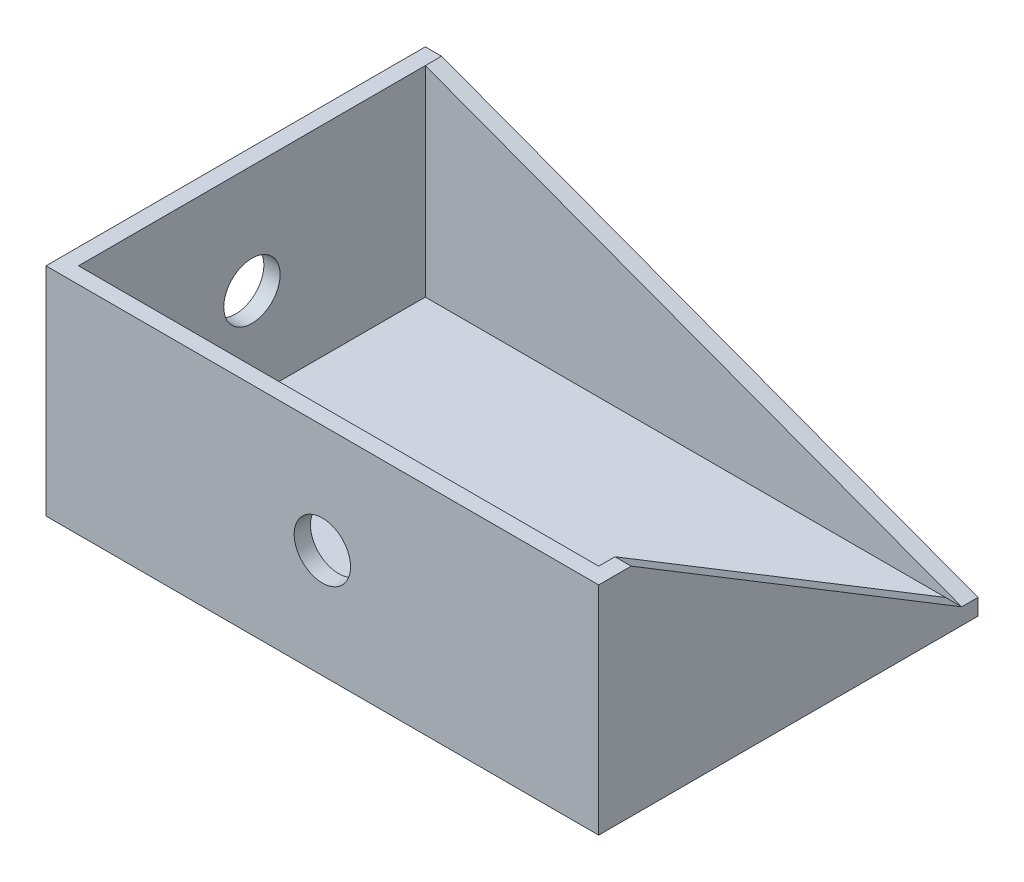
ISO-10303-21;
HEADER;
FILE_DESCRIPTION(('STEP AP214'),'2;1');
FILE_NAME('part.step','',(''),(''),'','','');
FILE_SCHEMA(('AUTOMOTIVE_DESIGN { 1 0 10303 214 1 1 1 1 }'));
ENDSEC;
DATA;
#1=APPLICATION_CONTEXT('core data for automotive mechanical design processes');
#2=APPLICATION_PROTOCOL_DEFINITION('international standard','automotive_design',2000,#1);
#3=PRODUCT_CONTEXT('',#1,'mechanical');
#4=PRODUCT('Part','Part','',(#3));
#5=PRODUCT_RELATED_PRODUCT_CATEGORY('part','',(#4));
#6=PRODUCT_DEFINITION_FORMATION('','',#4);
#7=PRODUCT_DEFINITION_CONTEXT('part definition',#1,'design');
#8=PRODUCT_DEFINITION('design','',#6,#7);
#9=PRODUCT_DEFINITION_SHAPE('','',#8);
#10=(LENGTH_UNIT() NAMED_UNIT(*) SI_UNIT(.MILLI.,.METRE.));
#11=(NAMED_UNIT(*) PLANE_ANGLE_UNIT() SI_UNIT($,.RADIAN.));
#12=(NAMED_UNIT(*) SI_UNIT($,.STERADIAN.) SOLID_ANGLE_UNIT());
#13=UNCERTAINTY_MEASURE_WITH_UNIT(LENGTH_MEASURE(1.E-05),#10,'distance_accuracy_value','');
#14=(GEOMETRIC_REPRESENTATION_CONTEXT(3) GLOBAL_UNCERTAINTY_ASSIGNED_CONTEXT((#13)) GLOBAL_UNIT_ASSIGNED_CONTEXT((#10,
#11,#12)) REPRESENTATION_CONTEXT('',''));
#15=CARTESIAN_POINT('',(0.,0.,0.));
#16=DIRECTION('',(0.,0.,1.));
#17=DIRECTION('',(1.,0.,0.));
#18=AXIS2_PLACEMENT_3D('',#15,#16,#17);
#19=CARTESIAN_POINT('',(0.,20.,0.));
#20=DIRECTION('',(1.,0.,0.));
#21=DIRECTION('',(0.,0.,-1.));
#22=AXIS2_PLACEMENT_3D('',#19,#20,#21);
#23=PLANE('',#22);
#24=CARTESIAN_POINT('',(0.,10.,-17.5));
#25=DIRECTION('',(-1.,0.,0.));
#26=DIRECTION('',(0.,0.,1.));
#27=AXIS2_PLACEMENT_3D('',#24,#25,#26);
#28=CIRCLE('',#27,2.6);
#29=CARTESIAN_POINT('',(0.,10.,-14.9));
#30=VERTEX_POINT('',#29);
#31=EDGE_CURVE('E169',#30,#30,#28,.T.);
#32=ORIENTED_EDGE('',*,*,#31,.F.);
#33=EDGE_LOOP('',(#32));
#34=FACE_BOUND('',#33,.T.);
#35=DIRECTION('',(0.,0.,1.));
#36=VECTOR('',#35,1.);
#37=CARTESIAN_POINT('',(0.,0.,0.));
#38=LINE('',#37,#36);
#39=CARTESIAN_POINT('',(0.,0.,-35.));
#40=VERTEX_POINT('',#39);
#41=CARTESIAN_POINT('',(0.,0.,0.));
#42=VERTEX_POINT('',#41);
#43=EDGE_CURVE('E149',#40,#42,#38,.T.);
#44=ORIENTED_EDGE('',*,*,#43,.T.);
#45=DIRECTION('',(0.,-1.,0.));
#46=VECTOR('',#45,1.);
#47=CARTESIAN_POINT('',(0.,20.,0.));
#48=LINE('',#47,#46);
#49=CARTESIAN_POINT('',(0.,20.,0.));
#50=VERTEX_POINT('',#49);
#51=EDGE_CURVE('E47',#50,#42,#48,.T.);
#52=ORIENTED_EDGE('',*,*,#51,.F.);
#53=DIRECTION('',(0.,0.,1.));
#54=VECTOR('',#53,1.);
#55=CARTESIAN_POINT('',(0.,20.,0.));
#56=LINE('',#55,#54);
#57=CARTESIAN_POINT('',(0.,20.,-35.));
#58=VERTEX_POINT('',#57);
#59=EDGE_CURVE('E145',#58,#50,#56,.T.);
#60=ORIENTED_EDGE('',*,*,#59,.F.);
#61=DIRECTION('',(0.,-1.,0.));
#62=VECTOR('',#61,1.);
#63=CARTESIAN_POINT('',(0.,20.,-35.));
#64=LINE('',#63,#62);
#65=EDGE_CURVE('E143',#58,#40,#64,.T.);
#66=ORIENTED_EDGE('',*,*,#65,.T.);
#67=EDGE_LOOP('',(#44,#52,#60,#66));
#68=FACE_BOUND('',#67,.T.);
#69=ADVANCED_FACE('F39',(#34,#68),#23,.F.);
#70=CARTESIAN_POINT('',(0.,20.,0.));
#71=DIRECTION('',(0.,0.,-1.));
#72=DIRECTION('',(-1.,0.,0.));
#73=AXIS2_PLACEMENT_3D('',#70,#71,#72);
#74=PLANE('',#73);
#75=CARTESIAN_POINT('',(25.5,10.,0.));
#76=DIRECTION('',(0.,0.,1.));
#77=DIRECTION('',(1.,0.,0.));
#78=AXIS2_PLACEMENT_3D('',#75,#76,#77);
#79=CIRCLE('',#78,2.6);
#80=CARTESIAN_POINT('',(28.1,10.,0.));
#81=VERTEX_POINT('',#80);
#82=EDGE_CURVE('E166',#81,#81,#79,.T.);
#83=ORIENTED_EDGE('',*,*,#82,.F.);
#84=EDGE_LOOP('',(#83));
#85=FACE_BOUND('',#84,.T.);
#86=DIRECTION('',(1.,0.,0.));
#87=VECTOR('',#86,1.);
#88=CARTESIAN_POINT('',(0.,0.,0.));
#89=LINE('',#88,#87);
#90=CARTESIAN_POINT('',(51.,0.,0.));
#91=VERTEX_POINT('',#90);
#92=EDGE_CURVE('E152',#42,#91,#89,.T.);
#93=ORIENTED_EDGE('',*,*,#92,.T.);
#94=DIRECTION('',(0.,-1.,0.));
#95=VECTOR('',#94,1.);
#96=CARTESIAN_POINT('',(51.,20.,0.));
#97=LINE('',#96,#95);
#98=CARTESIAN_POINT('',(51.,20.,0.));
#99=VERTEX_POINT('',#98);
#100=EDGE_CURVE('E160',#99,#91,#97,.T.);
#101=ORIENTED_EDGE('',*,*,#100,.F.);
#102=DIRECTION('',(1.,0.,0.));
#103=VECTOR('',#102,1.);
#104=CARTESIAN_POINT('',(0.,20.,0.));
#105=LINE('',#104,#103);
#106=EDGE_CURVE('E83',#50,#99,#105,.T.);
#107=ORIENTED_EDGE('',*,*,#106,.F.);
#108=ORIENTED_EDGE('',*,*,#51,.T.);
#109=EDGE_LOOP('',(#93,#101,#107,#108));
#110=FACE_BOUND('',#109,.T.);
#111=ADVANCED_FACE('F209',(#85,#110),#74,.F.);
#112=CARTESIAN_POINT('',(51.,20.,0.));
#113=DIRECTION('',(-1.,0.,0.));
#114=DIRECTION('',(0.,0.,1.));
#115=AXIS2_PLACEMENT_3D('',#112,#113,#114);
#116=PLANE('',#115);
#117=DIRECTION('',(0.,0.,-1.));
#118=VECTOR('',#117,1.);
#119=CARTESIAN_POINT('',(51.,1.5,-33.5));
#120=LINE('',#119,#118);
#121=CARTESIAN_POINT('',(51.,1.5,-33.5));
#122=VERTEX_POINT('',#121);
#123=CARTESIAN_POINT('',(51.,1.5,-35.));
#124=VERTEX_POINT('',#123);
#125=EDGE_CURVE('E139',#122,#124,#120,.T.);
#126=ORIENTED_EDGE('',*,*,#125,.F.);
#127=DIRECTION('',(0.,-0.518612324026929,-0.855009507179532));
#128=VECTOR('',#127,1.);
#129=CARTESIAN_POINT('',(51.,1.5,-33.5));
#130=LINE('',#129,#128);
#131=CARTESIAN_POINT('',(51.,20.,-3.));
#132=VERTEX_POINT('',#131);
#133=EDGE_CURVE('E124',#132,#122,#130,.T.);
#134=ORIENTED_EDGE('',*,*,#133,.F.);
#135=DIRECTION('',(0.,0.,-1.));
#136=VECTOR('',#135,1.);
#137=CARTESIAN_POINT('',(51.,20.,0.));
#138=LINE('',#137,#136);
#139=EDGE_CURVE('E138',#99,#132,#138,.T.);
#140=ORIENTED_EDGE('',*,*,#139,.F.);
#141=ORIENTED_EDGE('',*,*,#100,.T.);
#142=DIRECTION('',(0.,0.,-1.));
#143=VECTOR('',#142,1.);
#144=CARTESIAN_POINT('',(51.,0.,0.));
#145=LINE('',#144,#143);
#146=CARTESIAN_POINT('',(51.,0.,-35.));
#147=VERTEX_POINT('',#146);
#148=EDGE_CURVE('E155',#91,#147,#145,.T.);
#149=ORIENTED_EDGE('',*,*,#148,.T.);
#150=DIRECTION('',(0.,-1.,0.));
#151=VECTOR('',#150,1.);
#152=CARTESIAN_POINT('',(51.,20.,-35.));
#153=LINE('',#152,#151);
#154=EDGE_CURVE('E74',#124,#147,#153,.T.);
#155=ORIENTED_EDGE('',*,*,#154,.F.);
#156=EDGE_LOOP('',(#126,#134,#140,#141,#149,#155));
#157=FACE_BOUND('',#156,.T.);
#158=ADVANCED_FACE('F136',(#157),#116,.F.);
#159=CARTESIAN_POINT('',(0.,20.,-35.));
#160=DIRECTION('',(0.,0.,1.));
#161=DIRECTION('',(1.,0.,0.));
#162=AXIS2_PLACEMENT_3D('',#159,#160,#161);
#163=PLANE('',#162);
#164=DIRECTION('',(-1.,0.,0.));
#165=VECTOR('',#164,1.);
#166=CARTESIAN_POINT('',(0.,20.,-35.));
#167=LINE('',#166,#165);
#168=CARTESIAN_POINT('',(1.5,20.,-35.));
#169=VERTEX_POINT('',#168);
#170=EDGE_CURVE('E55',#169,#58,#167,.T.);
#171=ORIENTED_EDGE('',*,*,#170,.F.);
#172=DIRECTION('',(-0.936717444204777,0.350086317531078,0.));
#173=VECTOR('',#172,1.);
#174=CARTESIAN_POINT('',(1.5,20.,-35.));
#175=LINE('',#174,#173);
#176=EDGE_CURVE('E240',#124,#169,#175,.T.);
#177=ORIENTED_EDGE('',*,*,#176,.F.);
#178=ORIENTED_EDGE('',*,*,#154,.T.);
#179=DIRECTION('',(-1.,0.,0.));
#180=VECTOR('',#179,1.);
#181=CARTESIAN_POINT('',(0.,0.,-35.));
#182=LINE('',#181,#180);
#183=EDGE_CURVE('E77',#147,#40,#182,.T.);
#184=ORIENTED_EDGE('',*,*,#183,.T.);
#185=ORIENTED_EDGE('',*,*,#65,.F.);
#186=EDGE_LOOP('',(#171,#177,#178,#184,#185));
#187=FACE_BOUND('',#186,.T.);
#188=ADVANCED_FACE('F223',(#187),#163,.F.);
#189=CARTESIAN_POINT('',(0.,20.,0.));
#190=DIRECTION('',(0.,-1.,0.));
#191=DIRECTION('',(0.,0.,-1.));
#192=AXIS2_PLACEMENT_3D('',#189,#190,#191);
#193=PLANE('',#192);
#194=ORIENTED_EDGE('',*,*,#139,.T.);
#195=DIRECTION('',(1.,0.,0.));
#196=VECTOR('',#195,1.);
#197=CARTESIAN_POINT('',(48.,20.,-3.));
#198=LINE('',#197,#196);
#199=CARTESIAN_POINT('',(49.5,20.,-3.));
#200=VERTEX_POINT('',#199);
#201=EDGE_CURVE('E121',#200,#132,#198,.T.);
#202=ORIENTED_EDGE('',*,*,#201,.F.);
#203=DIRECTION('',(0.,0.,-1.));
#204=VECTOR('',#203,1.);
#205=CARTESIAN_POINT('',(49.5,20.,-1.5));
#206=LINE('',#205,#204);
#207=CARTESIAN_POINT('',(49.5,20.,-1.5));
#208=VERTEX_POINT('',#207);
#209=EDGE_CURVE('E182',#208,#200,#206,.T.);
#210=ORIENTED_EDGE('',*,*,#209,.F.);
#211=DIRECTION('',(1.,0.,0.));
#212=VECTOR('',#211,1.);
#213=CARTESIAN_POINT('',(1.5,20.,-1.5));
#214=LINE('',#213,#212);
#215=CARTESIAN_POINT('',(1.5,20.,-1.5));
#216=VERTEX_POINT('',#215);
#217=EDGE_CURVE('E185',#216,#208,#214,.T.);
#218=ORIENTED_EDGE('',*,*,#217,.F.);
#219=DIRECTION('',(0.,0.,1.));
#220=VECTOR('',#219,1.);
#221=CARTESIAN_POINT('',(1.5,20.,-33.5));
#222=LINE('',#221,#220);
#223=CARTESIAN_POINT('',(1.5,20.,-33.5));
#224=VERTEX_POINT('',#223);
#225=EDGE_CURVE('E165',#224,#216,#222,.T.);
#226=ORIENTED_EDGE('',*,*,#225,.F.);
#227=DIRECTION('',(0.,0.,-1.));
#228=VECTOR('',#227,1.);
#229=CARTESIAN_POINT('',(1.5,20.,-33.5));
#230=LINE('',#229,#228);
#231=EDGE_CURVE('E175',#224,#169,#230,.T.);
#232=ORIENTED_EDGE('',*,*,#231,.T.);
#233=ORIENTED_EDGE('',*,*,#170,.T.);
#234=ORIENTED_EDGE('',*,*,#59,.T.);
#235=ORIENTED_EDGE('',*,*,#106,.T.);
#236=EDGE_LOOP('',(#194,#202,#210,#218,#226,#232,#233,#234,#235));
#237=FACE_BOUND('',#236,.T.);
#238=ADVANCED_FACE('F141',(#237),#193,.F.);
#239=CARTESIAN_POINT('',(0.,0.,0.));
#240=DIRECTION('',(0.,-1.,0.));
#241=DIRECTION('',(0.,0.,-1.));
#242=AXIS2_PLACEMENT_3D('',#239,#240,#241);
#243=PLANE('',#242);
#244=ORIENTED_EDGE('',*,*,#43,.F.);
#245=ORIENTED_EDGE('',*,*,#183,.F.);
#246=ORIENTED_EDGE('',*,*,#148,.F.);
#247=ORIENTED_EDGE('',*,*,#92,.F.);
#248=EDGE_LOOP('',(#244,#245,#246,#247));
#249=FACE_BOUND('',#248,.T.);
#250=ADVANCED_FACE('F212',(#249),#243,.T.);
#251=CARTESIAN_POINT('',(0.,1.5,0.));
#252=DIRECTION('',(0.,-1.,0.));
#253=DIRECTION('',(0.,0.,-1.));
#254=AXIS2_PLACEMENT_3D('',#251,#252,#253);
#255=PLANE('',#254);
#256=DIRECTION('',(-1.,0.,0.));
#257=VECTOR('',#256,1.);
#258=CARTESIAN_POINT('',(49.5,1.5,-33.5));
#259=LINE('',#258,#257);
#260=CARTESIAN_POINT('',(49.5,1.5,-33.5));
#261=VERTEX_POINT('',#260);
#262=CARTESIAN_POINT('',(1.5,1.5,-33.5));
#263=VERTEX_POINT('',#262);
#264=EDGE_CURVE('E193',#261,#263,#259,.T.);
#265=ORIENTED_EDGE('',*,*,#264,.T.);
#266=DIRECTION('',(0.,0.,1.));
#267=VECTOR('',#266,1.);
#268=CARTESIAN_POINT('',(1.5,1.5,-33.5));
#269=LINE('',#268,#267);
#270=CARTESIAN_POINT('',(1.5,1.5,-1.5));
#271=VERTEX_POINT('',#270);
#272=EDGE_CURVE('E184',#263,#271,#269,.T.);
#273=ORIENTED_EDGE('',*,*,#272,.T.);
#274=DIRECTION('',(1.,0.,0.));
#275=VECTOR('',#274,1.);
#276=CARTESIAN_POINT('',(1.5,1.5,-1.5));
#277=LINE('',#276,#275);
#278=CARTESIAN_POINT('',(49.5,1.5,-1.5));
#279=VERTEX_POINT('',#278);
#280=EDGE_CURVE('E199',#271,#279,#277,.T.);
#281=ORIENTED_EDGE('',*,*,#280,.T.);
#282=DIRECTION('',(0.,0.,-1.));
#283=VECTOR('',#282,1.);
#284=CARTESIAN_POINT('',(49.5,1.5,-1.5));
#285=LINE('',#284,#283);
#286=EDGE_CURVE('E195',#279,#261,#285,.T.);
#287=ORIENTED_EDGE('',*,*,#286,.T.);
#288=EDGE_LOOP('',(#265,#273,#281,#287));
#289=FACE_BOUND('',#288,.T.);
#290=ADVANCED_FACE('F214',(#289),#255,.F.);
#291=CARTESIAN_POINT('',(1.5,-57.6888204074238,-33.5));
#292=DIRECTION('',(-1.,0.,0.));
#293=DIRECTION('',(0.,0.,1.));
#294=AXIS2_PLACEMENT_3D('',#291,#292,#293);
#295=PLANE('',#294);
#296=CARTESIAN_POINT('',(1.5,10.,-17.5));
#297=DIRECTION('',(-1.,0.,0.));
#298=DIRECTION('',(0.,0.,1.));
#299=AXIS2_PLACEMENT_3D('',#296,#297,#298);
#300=CIRCLE('',#299,2.6);
#301=CARTESIAN_POINT('',(1.5,10.,-14.9));
#302=VERTEX_POINT('',#301);
#303=EDGE_CURVE('E167',#302,#302,#300,.T.);
#304=ORIENTED_EDGE('',*,*,#303,.T.);
#305=EDGE_LOOP('',(#304));
#306=FACE_BOUND('',#305,.T.);
#307=DIRECTION('',(0.,1.,0.));
#308=VECTOR('',#307,1.);
#309=CARTESIAN_POINT('',(1.5,-57.6888204074238,-33.5));
#310=LINE('',#309,#308);
#311=EDGE_CURVE('E153',#263,#224,#310,.T.);
#312=ORIENTED_EDGE('',*,*,#311,.T.);
#313=ORIENTED_EDGE('',*,*,#225,.T.);
#314=DIRECTION('',(0.,1.,0.));
#315=VECTOR('',#314,1.);
#316=CARTESIAN_POINT('',(1.5,-57.6888204074238,-1.5));
#317=LINE('',#316,#315);
#318=EDGE_CURVE('E192',#271,#216,#317,.T.);
#319=ORIENTED_EDGE('',*,*,#318,.F.);
#320=ORIENTED_EDGE('',*,*,#272,.F.);
#321=EDGE_LOOP('',(#312,#313,#319,#320));
#322=FACE_BOUND('',#321,.T.);
#323=ADVANCED_FACE('F220',(#306,#322),#295,.F.);
#324=CARTESIAN_POINT('',(1.5,-57.6888204074238,-1.5));
#325=DIRECTION('',(0.,0.,1.));
#326=DIRECTION('',(1.,0.,0.));
#327=AXIS2_PLACEMENT_3D('',#324,#325,#326);
#328=PLANE('',#327);
#329=CARTESIAN_POINT('',(25.5,10.,-1.5));
#330=DIRECTION('',(0.,0.,1.));
#331=DIRECTION('',(1.,0.,0.));
#332=AXIS2_PLACEMENT_3D('',#329,#330,#331);
#333=CIRCLE('',#332,2.6);
#334=CARTESIAN_POINT('',(28.1,10.,-1.5));
#335=VERTEX_POINT('',#334);
#336=EDGE_CURVE('E163',#335,#335,#333,.T.);
#337=ORIENTED_EDGE('',*,*,#336,.T.);
#338=EDGE_LOOP('',(#337));
#339=FACE_BOUND('',#338,.T.);
#340=ORIENTED_EDGE('',*,*,#318,.T.);
#341=ORIENTED_EDGE('',*,*,#217,.T.);
#342=DIRECTION('',(0.,1.,0.));
#343=VECTOR('',#342,1.);
#344=CARTESIAN_POINT('',(49.5,-57.6888204074238,-1.5));
#345=LINE('',#344,#343);
#346=EDGE_CURVE('E198',#279,#208,#345,.T.);
#347=ORIENTED_EDGE('',*,*,#346,.F.);
#348=ORIENTED_EDGE('',*,*,#280,.F.);
#349=EDGE_LOOP('',(#340,#341,#347,#348));
#350=FACE_BOUND('',#349,.T.);
#351=ADVANCED_FACE('F256',(#339,#350),#328,.F.);
#352=CARTESIAN_POINT('',(49.5,-57.6888204074238,-1.5));
#353=DIRECTION('',(1.,0.,0.));
#354=DIRECTION('',(0.,0.,-1.));
#355=AXIS2_PLACEMENT_3D('',#352,#353,#354);
#356=PLANE('',#355);
#357=ORIENTED_EDGE('',*,*,#209,.T.);
#358=DIRECTION('',(0.,-0.51861232402693,-0.855009507179533));
#359=VECTOR('',#358,1.);
#360=CARTESIAN_POINT('',(49.5,-0.229959752016347,-36.3520958073783));
#361=LINE('',#360,#359);
#362=EDGE_CURVE('E127',#200,#261,#361,.T.);
#363=ORIENTED_EDGE('',*,*,#362,.T.);
#364=ORIENTED_EDGE('',*,*,#286,.F.);
#365=ORIENTED_EDGE('',*,*,#346,.T.);
#366=EDGE_LOOP('',(#357,#363,#364,#365));
#367=FACE_BOUND('',#366,.T.);
#368=ADVANCED_FACE('F251',(#367),#356,.F.);
#369=CARTESIAN_POINT('',(49.5,-57.6888204074238,-33.5));
#370=DIRECTION('',(0.,0.,-1.));
#371=DIRECTION('',(-1.,0.,0.));
#372=AXIS2_PLACEMENT_3D('',#369,#370,#371);
#373=PLANE('',#372);
#374=ORIENTED_EDGE('',*,*,#311,.F.);
#375=ORIENTED_EDGE('',*,*,#264,.F.);
#376=DIRECTION('',(1.,0.,0.));
#377=VECTOR('',#376,1.);
#378=CARTESIAN_POINT('',(48.,1.5,-33.5));
#379=LINE('',#378,#377);
#380=EDGE_CURVE('E131',#261,#122,#379,.T.);
#381=ORIENTED_EDGE('',*,*,#380,.T.);
#382=DIRECTION('',(-0.936717444204777,0.350086317531078,0.));
#383=VECTOR('',#382,1.);
#384=CARTESIAN_POINT('',(69.0937465669108,-5.26230932298685,-33.5));
#385=LINE('',#384,#383);
#386=EDGE_CURVE('E12',#122,#224,#385,.T.);
#387=ORIENTED_EDGE('',*,*,#386,.T.);
#388=EDGE_LOOP('',(#374,#375,#381,#387));
#389=FACE_BOUND('',#388,.T.);
#390=ADVANCED_FACE('F249',(#389),#373,.F.);
#391=CARTESIAN_POINT('',(25.5,10.,-3.));
#392=DIRECTION('',(0.,0.,1.));
#393=DIRECTION('',(1.,0.,0.));
#394=AXIS2_PLACEMENT_3D('',#391,#392,#393);
#395=CYLINDRICAL_SURFACE('',#394,2.6);
#396=ORIENTED_EDGE('',*,*,#82,.T.);
#397=EDGE_LOOP('',(#396));
#398=FACE_BOUND('',#397,.T.);
#399=ORIENTED_EDGE('',*,*,#336,.F.);
#400=EDGE_LOOP('',(#399));
#401=FACE_BOUND('',#400,.T.);
#402=ADVANCED_FACE('F272',(#398,#401),#395,.F.);
#403=CARTESIAN_POINT('',(3.,10.,-17.5));
#404=DIRECTION('',(-1.,0.,0.));
#405=DIRECTION('',(0.,0.,1.));
#406=AXIS2_PLACEMENT_3D('',#403,#404,#405);
#407=CYLINDRICAL_SURFACE('',#406,2.6);
#408=ORIENTED_EDGE('',*,*,#31,.T.);
#409=EDGE_LOOP('',(#408));
#410=FACE_BOUND('',#409,.T.);
#411=ORIENTED_EDGE('',*,*,#303,.F.);
#412=EDGE_LOOP('',(#411));
#413=FACE_BOUND('',#412,.T.);
#414=ADVANCED_FACE('F275',(#410,#413),#407,.F.);
#415=CARTESIAN_POINT('',(1.5,20.,-33.5));
#416=DIRECTION('',(-0.350086317531078,-0.936717444204777,0.));
#417=DIRECTION('',(0.936717444204777,-0.350086317531078,0.));
#418=AXIS2_PLACEMENT_3D('',#415,#416,#417);
#419=PLANE('',#418);
#420=ORIENTED_EDGE('',*,*,#176,.T.);
#421=ORIENTED_EDGE('',*,*,#231,.F.);
#422=ORIENTED_EDGE('',*,*,#386,.F.);
#423=ORIENTED_EDGE('',*,*,#125,.T.);
#424=EDGE_LOOP('',(#420,#421,#422,#423));
#425=FACE_BOUND('',#424,.T.);
#426=ADVANCED_FACE('F279',(#425),#419,.F.);
#427=CARTESIAN_POINT('',(48.,1.5,-33.5));
#428=DIRECTION('',(0.,-0.855009507179532,0.518612324026929));
#429=DIRECTION('',(0.,-0.51861232402693,-0.855009507179533));
#430=AXIS2_PLACEMENT_3D('',#427,#428,#429);
#431=PLANE('',#430);
#432=ORIENTED_EDGE('',*,*,#201,.T.);
#433=ORIENTED_EDGE('',*,*,#133,.T.);
#434=ORIENTED_EDGE('',*,*,#380,.F.);
#435=ORIENTED_EDGE('',*,*,#362,.F.);
#436=EDGE_LOOP('',(#432,#433,#434,#435));
#437=FACE_BOUND('',#436,.T.);
#438=ADVANCED_FACE('F123',(#437),#431,.F.);
#439=CLOSED_SHELL('',(#69,#111,#158,#188,#238,#250,#290,#323,#351,#368,#390,#402,#414,#426,#438));
#440=MANIFOLD_SOLID_BREP('B2',#439);
#441=ADVANCED_BREP_SHAPE_REPRESENTATION('',(#18,#440),#14);
#442=SHAPE_DEFINITION_REPRESENTATION(#9,#441);
ENDSEC;
END-ISO-10303-21;
